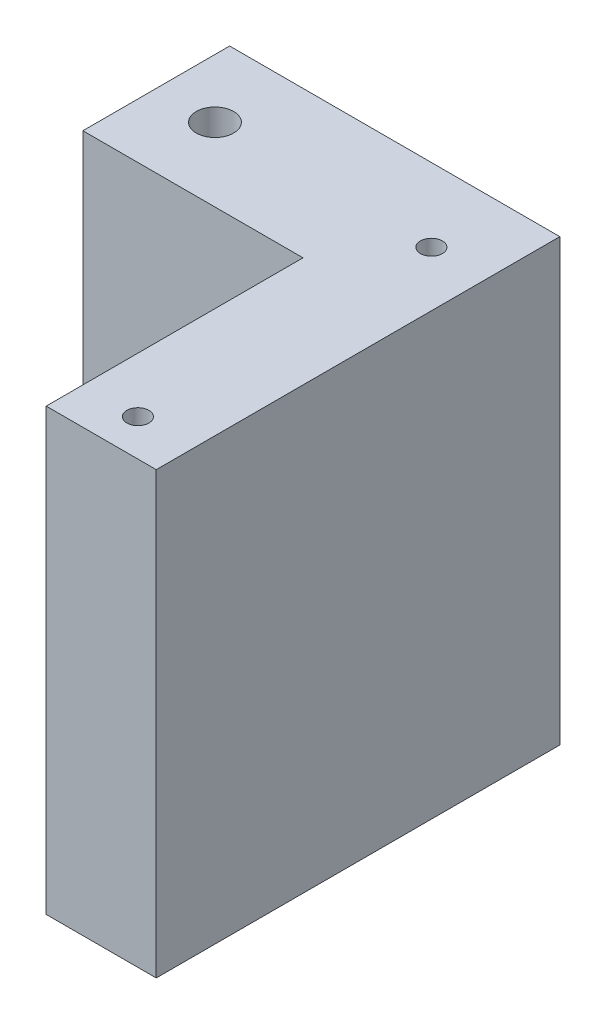
ISO-10303-21;
HEADER;
FILE_DESCRIPTION(('STEP AP214'),'2;1');
FILE_NAME('part.step','',(''),(''),'','','');
FILE_SCHEMA(('AUTOMOTIVE_DESIGN { 1 0 10303 214 1 1 1 1 }'));
ENDSEC;
DATA;
#1=APPLICATION_CONTEXT('core data for automotive mechanical design processes');
#2=APPLICATION_PROTOCOL_DEFINITION('international standard','automotive_design',2000,#1);
#3=PRODUCT_CONTEXT('',#1,'mechanical');
#4=PRODUCT('Part','Part','',(#3));
#5=PRODUCT_RELATED_PRODUCT_CATEGORY('part','',(#4));
#6=PRODUCT_DEFINITION_FORMATION('','',#4);
#7=PRODUCT_DEFINITION_CONTEXT('part definition',#1,'design');
#8=PRODUCT_DEFINITION('design','',#6,#7);
#9=PRODUCT_DEFINITION_SHAPE('','',#8);
#10=(LENGTH_UNIT() NAMED_UNIT(*) SI_UNIT(.MILLI.,.METRE.));
#11=(NAMED_UNIT(*) PLANE_ANGLE_UNIT() SI_UNIT($,.RADIAN.));
#12=(NAMED_UNIT(*) SI_UNIT($,.STERADIAN.) SOLID_ANGLE_UNIT());
#13=UNCERTAINTY_MEASURE_WITH_UNIT(LENGTH_MEASURE(1.E-05),#10,'distance_accuracy_value','');
#14=(GEOMETRIC_REPRESENTATION_CONTEXT(3) GLOBAL_UNCERTAINTY_ASSIGNED_CONTEXT((#13)) GLOBAL_UNIT_ASSIGNED_CONTEXT((#10,
#11,#12)) REPRESENTATION_CONTEXT('',''));
#15=CARTESIAN_POINT('',(0.,0.,0.));
#16=DIRECTION('',(0.,0.,1.));
#17=DIRECTION('',(1.,0.,0.));
#18=AXIS2_PLACEMENT_3D('',#15,#16,#17);
#19=CARTESIAN_POINT('',(7.5,60.,0.));
#20=DIRECTION('',(1.,0.,0.));
#21=DIRECTION('',(0.,0.,-1.));
#22=AXIS2_PLACEMENT_3D('',#19,#20,#21);
#23=PLANE('',#22);
#24=DIRECTION('',(0.,0.,1.));
#25=VECTOR('',#24,1.);
#26=CARTESIAN_POINT('',(7.5,0.,0.));
#27=LINE('',#26,#25);
#28=CARTESIAN_POINT('',(7.5,0.,-27.5));
#29=VERTEX_POINT('',#28);
#30=CARTESIAN_POINT('',(7.5,0.,27.5));
#31=VERTEX_POINT('',#30);
#32=EDGE_CURVE('E153',#29,#31,#27,.T.);
#33=ORIENTED_EDGE('',*,*,#32,.F.);
#34=DIRECTION('',(0.,-1.,0.));
#35=VECTOR('',#34,1.);
#36=CARTESIAN_POINT('',(7.5,60.,-27.5));
#37=LINE('',#36,#35);
#38=CARTESIAN_POINT('',(7.5,60.,-27.5));
#39=VERTEX_POINT('',#38);
#40=EDGE_CURVE('E11',#39,#29,#37,.T.);
#41=ORIENTED_EDGE('',*,*,#40,.F.);
#42=DIRECTION('',(0.,0.,1.));
#43=VECTOR('',#42,1.);
#44=CARTESIAN_POINT('',(7.5,60.,0.));
#45=LINE('',#44,#43);
#46=CARTESIAN_POINT('',(7.5,60.,27.5));
#47=VERTEX_POINT('',#46);
#48=EDGE_CURVE('E330',#39,#47,#45,.T.);
#49=ORIENTED_EDGE('',*,*,#48,.T.);
#50=DIRECTION('',(0.,-1.,0.));
#51=VECTOR('',#50,1.);
#52=CARTESIAN_POINT('',(7.5,60.,27.5));
#53=LINE('',#52,#51);
#54=EDGE_CURVE('E94',#47,#31,#53,.T.);
#55=ORIENTED_EDGE('',*,*,#54,.T.);
#56=EDGE_LOOP('',(#33,#41,#49,#55));
#57=FACE_BOUND('',#56,.T.);
#58=ADVANCED_FACE('F47',(#57),#23,.T.);
#59=CARTESIAN_POINT('',(0.,60.,-27.5));
#60=DIRECTION('',(0.,0.,-1.));
#61=DIRECTION('',(-1.,0.,0.));
#62=AXIS2_PLACEMENT_3D('',#59,#60,#61);
#63=PLANE('',#62);
#64=CARTESIAN_POINT('',(-22.5,5.,-27.5));
#65=DIRECTION('',(0.,0.,-1.));
#66=DIRECTION('',(-1.,0.,0.));
#67=AXIS2_PLACEMENT_3D('',#64,#65,#66);
#68=CIRCLE('',#67,2.5);
#69=CARTESIAN_POINT('',(-25.,5.,-27.5));
#70=VERTEX_POINT('',#69);
#71=EDGE_CURVE('E319',#70,#70,#68,.T.);
#72=ORIENTED_EDGE('',*,*,#71,.F.);
#73=EDGE_LOOP('',(#72));
#74=FACE_BOUND('',#73,.T.);
#75=DIRECTION('',(1.,0.,0.));
#76=VECTOR('',#75,1.);
#77=CARTESIAN_POINT('',(0.,0.,-27.5));
#78=LINE('',#77,#76);
#79=CARTESIAN_POINT('',(-37.5,0.,-27.5));
#80=VERTEX_POINT('',#79);
#81=EDGE_CURVE('E156',#80,#29,#78,.T.);
#82=ORIENTED_EDGE('',*,*,#81,.F.);
#83=DIRECTION('',(0.,-1.,0.));
#84=VECTOR('',#83,1.);
#85=CARTESIAN_POINT('',(-37.5,60.,-27.5));
#86=LINE('',#85,#84);
#87=CARTESIAN_POINT('',(-37.5,60.,-27.5));
#88=VERTEX_POINT('',#87);
#89=EDGE_CURVE('E57',#88,#80,#86,.T.);
#90=ORIENTED_EDGE('',*,*,#89,.F.);
#91=DIRECTION('',(1.,0.,0.));
#92=VECTOR('',#91,1.);
#93=CARTESIAN_POINT('',(0.,60.,-27.5));
#94=LINE('',#93,#92);
#95=EDGE_CURVE('E134',#88,#39,#94,.T.);
#96=ORIENTED_EDGE('',*,*,#95,.T.);
#97=ORIENTED_EDGE('',*,*,#40,.T.);
#98=EDGE_LOOP('',(#82,#90,#96,#97));
#99=FACE_BOUND('',#98,.T.);
#100=ADVANCED_FACE('F190',(#74,#99),#63,.T.);
#101=CARTESIAN_POINT('',(-37.5,60.,0.));
#102=DIRECTION('',(1.,0.,0.));
#103=DIRECTION('',(0.,0.,-1.));
#104=AXIS2_PLACEMENT_3D('',#101,#102,#103);
#105=PLANE('',#104);
#106=DIRECTION('',(0.,0.,1.));
#107=VECTOR('',#106,1.);
#108=CARTESIAN_POINT('',(-37.5,0.,0.));
#109=LINE('',#108,#107);
#110=CARTESIAN_POINT('',(-37.5,0.,-7.49999999999999));
#111=VERTEX_POINT('',#110);
#112=EDGE_CURVE('E160',#80,#111,#109,.T.);
#113=ORIENTED_EDGE('',*,*,#112,.T.);
#114=DIRECTION('',(0.,-1.,0.));
#115=VECTOR('',#114,1.);
#116=CARTESIAN_POINT('',(-37.5,60.,-7.49999999999999));
#117=LINE('',#116,#115);
#118=CARTESIAN_POINT('',(-37.5,60.,-7.49999999999999));
#119=VERTEX_POINT('',#118);
#120=EDGE_CURVE('E117',#119,#111,#117,.T.);
#121=ORIENTED_EDGE('',*,*,#120,.F.);
#122=DIRECTION('',(0.,0.,1.));
#123=VECTOR('',#122,1.);
#124=CARTESIAN_POINT('',(-37.5,60.,0.));
#125=LINE('',#124,#123);
#126=EDGE_CURVE('E129',#88,#119,#125,.T.);
#127=ORIENTED_EDGE('',*,*,#126,.F.);
#128=ORIENTED_EDGE('',*,*,#89,.T.);
#129=EDGE_LOOP('',(#113,#121,#127,#128));
#130=FACE_BOUND('',#129,.T.);
#131=ADVANCED_FACE('F184',(#130),#105,.F.);
#132=CARTESIAN_POINT('',(0.,60.,-7.49999999999999));
#133=DIRECTION('',(0.,0.,1.));
#134=DIRECTION('',(1.,0.,0.));
#135=AXIS2_PLACEMENT_3D('',#132,#133,#134);
#136=PLANE('',#135);
#137=CARTESIAN_POINT('',(-22.5,5.,-7.5));
#138=DIRECTION('',(0.,0.,-1.));
#139=DIRECTION('',(-1.,0.,0.));
#140=AXIS2_PLACEMENT_3D('',#137,#138,#139);
#141=CIRCLE('',#140,2.5);
#142=CARTESIAN_POINT('',(-25.,5.,-7.5));
#143=VERTEX_POINT('',#142);
#144=EDGE_CURVE('E149',#143,#143,#141,.T.);
#145=ORIENTED_EDGE('',*,*,#144,.T.);
#146=EDGE_LOOP('',(#145));
#147=FACE_BOUND('',#146,.T.);
#148=DIRECTION('',(-1.,0.,0.));
#149=VECTOR('',#148,1.);
#150=CARTESIAN_POINT('',(0.,0.,-7.49999999999999));
#151=LINE('',#150,#149);
#152=CARTESIAN_POINT('',(-7.5,0.,-7.49999999999999));
#153=VERTEX_POINT('',#152);
#154=EDGE_CURVE('E113',#153,#111,#151,.T.);
#155=ORIENTED_EDGE('',*,*,#154,.F.);
#156=DIRECTION('',(0.,-1.,0.));
#157=VECTOR('',#156,1.);
#158=CARTESIAN_POINT('',(-7.5,60.,-7.49999999999999));
#159=LINE('',#158,#157);
#160=CARTESIAN_POINT('',(-7.5,60.,-7.49999999999999));
#161=VERTEX_POINT('',#160);
#162=EDGE_CURVE('E107',#161,#153,#159,.T.);
#163=ORIENTED_EDGE('',*,*,#162,.F.);
#164=DIRECTION('',(-1.,0.,0.));
#165=VECTOR('',#164,1.);
#166=CARTESIAN_POINT('',(0.,60.,-7.49999999999999));
#167=LINE('',#166,#165);
#168=EDGE_CURVE('E111',#161,#119,#167,.T.);
#169=ORIENTED_EDGE('',*,*,#168,.T.);
#170=ORIENTED_EDGE('',*,*,#120,.T.);
#171=EDGE_LOOP('',(#155,#163,#169,#170));
#172=FACE_BOUND('',#171,.T.);
#173=ADVANCED_FACE('F109',(#147,#172),#136,.T.);
#174=CARTESIAN_POINT('',(-7.5,60.,0.));
#175=DIRECTION('',(1.,0.,0.));
#176=DIRECTION('',(0.,0.,-1.));
#177=AXIS2_PLACEMENT_3D('',#174,#175,#176);
#178=PLANE('',#177);
#179=DIRECTION('',(0.,0.,1.));
#180=VECTOR('',#179,1.);
#181=CARTESIAN_POINT('',(-7.5,0.,0.));
#182=LINE('',#181,#180);
#183=CARTESIAN_POINT('',(-7.5,0.,27.5));
#184=VERTEX_POINT('',#183);
#185=EDGE_CURVE('E166',#153,#184,#182,.T.);
#186=ORIENTED_EDGE('',*,*,#185,.T.);
#187=DIRECTION('',(0.,-1.,0.));
#188=VECTOR('',#187,1.);
#189=CARTESIAN_POINT('',(-7.5,60.,27.5));
#190=LINE('',#189,#188);
#191=CARTESIAN_POINT('',(-7.5,60.,27.5));
#192=VERTEX_POINT('',#191);
#193=EDGE_CURVE('E118',#192,#184,#190,.T.);
#194=ORIENTED_EDGE('',*,*,#193,.F.);
#195=DIRECTION('',(0.,0.,1.));
#196=VECTOR('',#195,1.);
#197=CARTESIAN_POINT('',(-7.5,60.,0.));
#198=LINE('',#197,#196);
#199=EDGE_CURVE('E121',#161,#192,#198,.T.);
#200=ORIENTED_EDGE('',*,*,#199,.F.);
#201=ORIENTED_EDGE('',*,*,#162,.T.);
#202=EDGE_LOOP('',(#186,#194,#200,#201));
#203=FACE_BOUND('',#202,.T.);
#204=ADVANCED_FACE('F122',(#203),#178,.F.);
#205=CARTESIAN_POINT('',(0.,60.,27.5));
#206=DIRECTION('',(0.,0.,-1.));
#207=DIRECTION('',(-1.,0.,0.));
#208=AXIS2_PLACEMENT_3D('',#205,#206,#207);
#209=PLANE('',#208);
#210=DIRECTION('',(1.,0.,0.));
#211=VECTOR('',#210,1.);
#212=CARTESIAN_POINT('',(0.,0.,27.5));
#213=LINE('',#212,#211);
#214=EDGE_CURVE('E87',#184,#31,#213,.T.);
#215=ORIENTED_EDGE('',*,*,#214,.T.);
#216=ORIENTED_EDGE('',*,*,#54,.F.);
#217=DIRECTION('',(1.,0.,0.));
#218=VECTOR('',#217,1.);
#219=CARTESIAN_POINT('',(0.,60.,27.5));
#220=LINE('',#219,#218);
#221=EDGE_CURVE('E65',#192,#47,#220,.T.);
#222=ORIENTED_EDGE('',*,*,#221,.F.);
#223=ORIENTED_EDGE('',*,*,#193,.T.);
#224=EDGE_LOOP('',(#215,#216,#222,#223));
#225=FACE_BOUND('',#224,.T.);
#226=ADVANCED_FACE('F202',(#225),#209,.F.);
#227=CARTESIAN_POINT('',(0.,60.,-17.5));
#228=DIRECTION('',(0.,-1.,0.));
#229=DIRECTION('',(0.,0.,-1.));
#230=AXIS2_PLACEMENT_3D('',#227,#228,#229);
#231=CYLINDRICAL_SURFACE('',#230,1.5);
#232=CARTESIAN_POINT('',(0.,60.,-17.5));
#233=DIRECTION('',(0.,1.,0.));
#234=DIRECTION('',(0.,0.,1.));
#235=AXIS2_PLACEMENT_3D('',#232,#233,#234);
#236=CIRCLE('',#235,1.5);
#237=CARTESIAN_POINT('',(0.,60.,-16.));
#238=VERTEX_POINT('',#237);
#239=EDGE_CURVE('E215',#238,#238,#236,.T.);
#240=ORIENTED_EDGE('',*,*,#239,.T.);
#241=EDGE_LOOP('',(#240));
#242=FACE_BOUND('',#241,.T.);
#243=CARTESIAN_POINT('',(0.,0.,-17.5));
#244=DIRECTION('',(0.,1.,0.));
#245=DIRECTION('',(0.,0.,1.));
#246=AXIS2_PLACEMENT_3D('',#243,#244,#245);
#247=CIRCLE('',#246,1.5);
#248=CARTESIAN_POINT('',(0.,0.,-16.));
#249=VERTEX_POINT('',#248);
#250=EDGE_CURVE('E148',#249,#249,#247,.T.);
#251=ORIENTED_EDGE('',*,*,#250,.F.);
#252=EDGE_LOOP('',(#251));
#253=FACE_BOUND('',#252,.T.);
#254=ADVANCED_FACE('F200',(#242,#253),#231,.F.);
#255=CARTESIAN_POINT('',(0.,60.,22.5));
#256=DIRECTION('',(0.,-1.,0.));
#257=DIRECTION('',(0.,0.,-1.));
#258=AXIS2_PLACEMENT_3D('',#255,#256,#257);
#259=CYLINDRICAL_SURFACE('',#258,1.5);
#260=CARTESIAN_POINT('',(0.,60.,22.5));
#261=DIRECTION('',(0.,1.,0.));
#262=DIRECTION('',(0.,0.,1.));
#263=AXIS2_PLACEMENT_3D('',#260,#261,#262);
#264=CIRCLE('',#263,1.5);
#265=CARTESIAN_POINT('',(0.,60.,24.));
#266=VERTEX_POINT('',#265);
#267=EDGE_CURVE('E175',#266,#266,#264,.T.);
#268=ORIENTED_EDGE('',*,*,#267,.T.);
#269=EDGE_LOOP('',(#268));
#270=FACE_BOUND('',#269,.T.);
#271=CARTESIAN_POINT('',(0.,0.,22.5));
#272=DIRECTION('',(0.,1.,0.));
#273=DIRECTION('',(0.,0.,1.));
#274=AXIS2_PLACEMENT_3D('',#271,#272,#273);
#275=CIRCLE('',#274,1.5);
#276=CARTESIAN_POINT('',(0.,0.,24.));
#277=VERTEX_POINT('',#276);
#278=EDGE_CURVE('E144',#277,#277,#275,.T.);
#279=ORIENTED_EDGE('',*,*,#278,.F.);
#280=EDGE_LOOP('',(#279));
#281=FACE_BOUND('',#280,.T.);
#282=ADVANCED_FACE('F49',(#270,#281),#259,.F.);
#283=CARTESIAN_POINT('',(-29.5,60.,-17.5));
#284=DIRECTION('',(0.,-1.,0.));
#285=DIRECTION('',(0.,0.,-1.));
#286=AXIS2_PLACEMENT_3D('',#283,#284,#285);
#287=CYLINDRICAL_SURFACE('',#286,2.55);
#288=CARTESIAN_POINT('',(-29.5,60.,-17.5));
#289=DIRECTION('',(0.,1.,0.));
#290=DIRECTION('',(0.,0.,1.));
#291=AXIS2_PLACEMENT_3D('',#288,#289,#290);
#292=CIRCLE('',#291,2.55);
#293=CARTESIAN_POINT('',(-29.5,60.,-14.95));
#294=VERTEX_POINT('',#293);
#295=EDGE_CURVE('E140',#294,#294,#292,.T.);
#296=ORIENTED_EDGE('',*,*,#295,.T.);
#297=EDGE_LOOP('',(#296));
#298=FACE_BOUND('',#297,.T.);
#299=CARTESIAN_POINT('',(-29.5,0.,-17.5));
#300=DIRECTION('',(0.,1.,0.));
#301=DIRECTION('',(0.,0.,1.));
#302=AXIS2_PLACEMENT_3D('',#299,#300,#301);
#303=CIRCLE('',#302,2.55);
#304=CARTESIAN_POINT('',(-29.5,0.,-14.95));
#305=VERTEX_POINT('',#304);
#306=EDGE_CURVE('E171',#305,#305,#303,.T.);
#307=ORIENTED_EDGE('',*,*,#306,.F.);
#308=EDGE_LOOP('',(#307));
#309=FACE_BOUND('',#308,.T.);
#310=ADVANCED_FACE('F208',(#298,#309),#287,.F.);
#311=CARTESIAN_POINT('',(0.,60.,0.));
#312=DIRECTION('',(0.,1.,0.));
#313=DIRECTION('',(0.,0.,1.));
#314=AXIS2_PLACEMENT_3D('',#311,#312,#313);
#315=PLANE('',#314);
#316=ORIENTED_EDGE('',*,*,#267,.F.);
#317=EDGE_LOOP('',(#316));
#318=FACE_BOUND('',#317,.T.);
#319=ORIENTED_EDGE('',*,*,#239,.F.);
#320=EDGE_LOOP('',(#319));
#321=FACE_BOUND('',#320,.T.);
#322=ORIENTED_EDGE('',*,*,#48,.F.);
#323=ORIENTED_EDGE('',*,*,#95,.F.);
#324=ORIENTED_EDGE('',*,*,#126,.T.);
#325=ORIENTED_EDGE('',*,*,#168,.F.);
#326=ORIENTED_EDGE('',*,*,#199,.T.);
#327=ORIENTED_EDGE('',*,*,#221,.T.);
#328=EDGE_LOOP('',(#322,#323,#324,#325,#326,#327));
#329=FACE_BOUND('',#328,.T.);
#330=ORIENTED_EDGE('',*,*,#295,.F.);
#331=EDGE_LOOP('',(#330));
#332=FACE_BOUND('',#331,.T.);
#333=ADVANCED_FACE('F125',(#318,#321,#329,#332),#315,.T.);
#334=CARTESIAN_POINT('',(0.,0.,0.));
#335=DIRECTION('',(0.,1.,0.));
#336=DIRECTION('',(0.,0.,1.));
#337=AXIS2_PLACEMENT_3D('',#334,#335,#336);
#338=PLANE('',#337);
#339=ORIENTED_EDGE('',*,*,#278,.T.);
#340=EDGE_LOOP('',(#339));
#341=FACE_BOUND('',#340,.T.);
#342=ORIENTED_EDGE('',*,*,#250,.T.);
#343=EDGE_LOOP('',(#342));
#344=FACE_BOUND('',#343,.T.);
#345=ORIENTED_EDGE('',*,*,#32,.T.);
#346=ORIENTED_EDGE('',*,*,#214,.F.);
#347=ORIENTED_EDGE('',*,*,#185,.F.);
#348=ORIENTED_EDGE('',*,*,#154,.T.);
#349=ORIENTED_EDGE('',*,*,#112,.F.);
#350=ORIENTED_EDGE('',*,*,#81,.T.);
#351=EDGE_LOOP('',(#345,#346,#347,#348,#349,#350));
#352=FACE_BOUND('',#351,.T.);
#353=ORIENTED_EDGE('',*,*,#306,.T.);
#354=EDGE_LOOP('',(#353));
#355=FACE_BOUND('',#354,.T.);
#356=ADVANCED_FACE('F188',(#341,#344,#352,#355),#338,.F.);
#357=CARTESIAN_POINT('',(-22.5,5.,-7.5));
#358=DIRECTION('',(0.,0.,-1.));
#359=DIRECTION('',(-1.,0.,0.));
#360=AXIS2_PLACEMENT_3D('',#357,#358,#359);
#361=CYLINDRICAL_SURFACE('',#360,2.5);
#362=ORIENTED_EDGE('',*,*,#144,.F.);
#363=EDGE_LOOP('',(#362));
#364=FACE_BOUND('',#363,.T.);
#365=ORIENTED_EDGE('',*,*,#71,.T.);
#366=EDGE_LOOP('',(#365));
#367=FACE_BOUND('',#366,.T.);
#368=ADVANCED_FACE('F219',(#364,#367),#361,.F.);
#369=CLOSED_SHELL('',(#58,#100,#131,#173,#204,#226,#254,#282,#310,#333,#356,#368));
#370=MANIFOLD_SOLID_BREP('B2',#369);
#371=ADVANCED_BREP_SHAPE_REPRESENTATION('',(#18,#370),#14);
#372=SHAPE_DEFINITION_REPRESENTATION(#9,#371);
ENDSEC;
END-ISO-10303-21;
